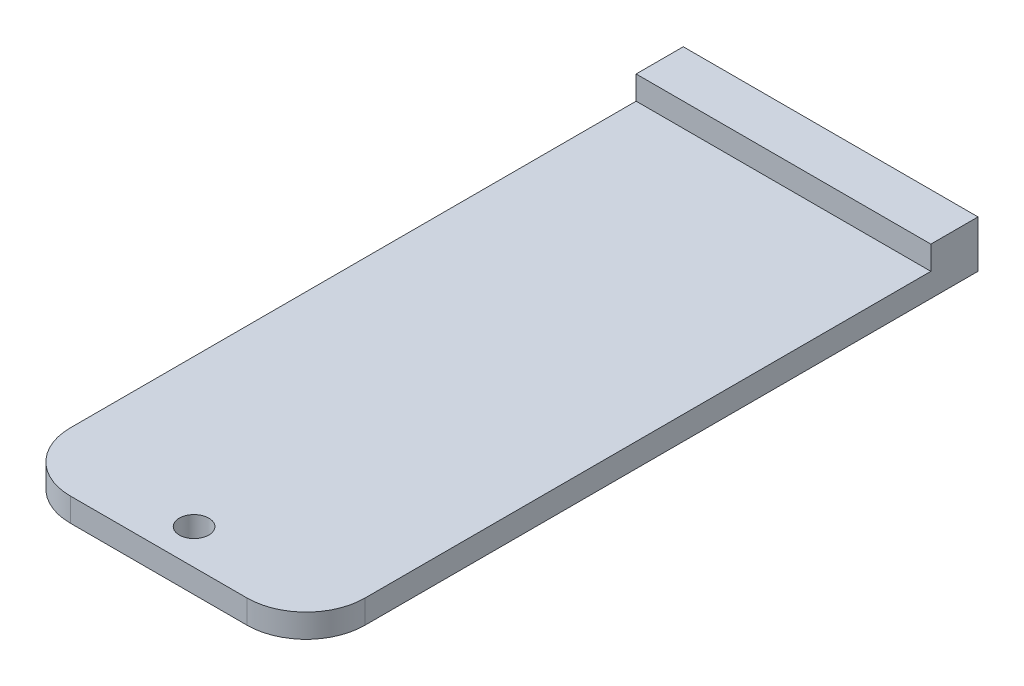
ISO-10303-21;
HEADER;
FILE_DESCRIPTION(('STEP AP214'),'2;1');
FILE_NAME('part.step','',(''),(''),'','','');
FILE_SCHEMA(('AUTOMOTIVE_DESIGN { 1 0 10303 214 1 1 1 1 }'));
ENDSEC;
DATA;
#1=APPLICATION_CONTEXT('core data for automotive mechanical design processes');
#2=APPLICATION_PROTOCOL_DEFINITION('international standard','automotive_design',2000,#1);
#3=PRODUCT_CONTEXT('',#1,'mechanical');
#4=PRODUCT('Part','Part','',(#3));
#5=PRODUCT_RELATED_PRODUCT_CATEGORY('part','',(#4));
#6=PRODUCT_DEFINITION_FORMATION('','',#4);
#7=PRODUCT_DEFINITION_CONTEXT('part definition',#1,'design');
#8=PRODUCT_DEFINITION('design','',#6,#7);
#9=PRODUCT_DEFINITION_SHAPE('','',#8);
#10=(LENGTH_UNIT() NAMED_UNIT(*) SI_UNIT(.MILLI.,.METRE.));
#11=(NAMED_UNIT(*) PLANE_ANGLE_UNIT() SI_UNIT($,.RADIAN.));
#12=(NAMED_UNIT(*) SI_UNIT($,.STERADIAN.) SOLID_ANGLE_UNIT());
#13=UNCERTAINTY_MEASURE_WITH_UNIT(LENGTH_MEASURE(1.E-05),#10,'distance_accuracy_value','');
#14=(GEOMETRIC_REPRESENTATION_CONTEXT(3) GLOBAL_UNCERTAINTY_ASSIGNED_CONTEXT((#13)) GLOBAL_UNIT_ASSIGNED_CONTEXT((#10,
#11,#12)) REPRESENTATION_CONTEXT('',''));
#15=CARTESIAN_POINT('',(0.,0.,0.));
#16=DIRECTION('',(0.,0.,1.));
#17=DIRECTION('',(1.,0.,0.));
#18=AXIS2_PLACEMENT_3D('',#15,#16,#17);
#19=CARTESIAN_POINT('',(-37.5,8.00000000000001,-72.0798724079689));
#20=DIRECTION('',(-1.,0.,0.));
#21=DIRECTION('',(0.,0.,1.));
#22=AXIS2_PLACEMENT_3D('',#19,#20,#21);
#23=PLANE('',#22);
#24=DIRECTION('',(0.,0.,1.));
#25=VECTOR('',#24,1.);
#26=CARTESIAN_POINT('',(-37.5,8.00000000000001,-72.0798724079689));
#27=LINE('',#26,#25);
#28=CARTESIAN_POINT('',(-37.5,8.00000000000001,-51.));
#29=VERTEX_POINT('',#28);
#30=CARTESIAN_POINT('',(-37.5,8.00000000000001,1.));
#31=VERTEX_POINT('',#30);
#32=EDGE_CURVE('E113',#29,#31,#27,.T.);
#33=ORIENTED_EDGE('',*,*,#32,.T.);
#34=DIRECTION('',(0.,-1.,0.));
#35=VECTOR('',#34,1.);
#36=CARTESIAN_POINT('',(-37.5,8.00000000000001,1.));
#37=LINE('',#36,#35);
#38=CARTESIAN_POINT('',(-37.5,10.,1.));
#39=VERTEX_POINT('',#38);
#40=EDGE_CURVE('E60',#31,#39,#37,.F.);
#41=ORIENTED_EDGE('',*,*,#40,.T.);
#42=DIRECTION('',(0.,0.,1.));
#43=VECTOR('',#42,1.);
#44=CARTESIAN_POINT('',(-37.5,10.,-72.0798724079689));
#45=LINE('',#44,#43);
#46=CARTESIAN_POINT('',(-37.5,10.,-47.));
#47=VERTEX_POINT('',#46);
#48=EDGE_CURVE('E163',#47,#39,#45,.T.);
#49=ORIENTED_EDGE('',*,*,#48,.F.);
#50=DIRECTION('',(0.,1.,0.));
#51=VECTOR('',#50,1.);
#52=CARTESIAN_POINT('',(-37.5,12.,-47.));
#53=LINE('',#52,#51);
#54=CARTESIAN_POINT('',(-37.5,12.,-47.));
#55=VERTEX_POINT('',#54);
#56=EDGE_CURVE('E140',#47,#55,#53,.T.);
#57=ORIENTED_EDGE('',*,*,#56,.T.);
#58=DIRECTION('',(0.,0.,1.));
#59=VECTOR('',#58,1.);
#60=CARTESIAN_POINT('',(-37.5,12.,-51.));
#61=LINE('',#60,#59);
#62=CARTESIAN_POINT('',(-37.5,12.,-51.));
#63=VERTEX_POINT('',#62);
#64=EDGE_CURVE('E147',#63,#55,#61,.T.);
#65=ORIENTED_EDGE('',*,*,#64,.F.);
#66=DIRECTION('',(0.,1.,0.));
#67=VECTOR('',#66,1.);
#68=CARTESIAN_POINT('',(-37.5,8.00000000000001,-51.));
#69=LINE('',#68,#67);
#70=EDGE_CURVE('E121',#29,#63,#69,.T.);
#71=ORIENTED_EDGE('',*,*,#70,.F.);
#72=EDGE_LOOP('',(#33,#41,#49,#57,#65,#71));
#73=FACE_BOUND('',#72,.T.);
#74=ADVANCED_FACE('F35',(#73),#23,.T.);
#75=CARTESIAN_POINT('',(-37.5,10.,-72.0798724079689));
#76=DIRECTION('',(0.,1.,0.));
#77=DIRECTION('',(-1.,0.,0.));
#78=AXIS2_PLACEMENT_3D('',#75,#76,#77);
#79=PLANE('',#78);
#80=CARTESIAN_POINT('',(-25.,10.,3.));
#81=DIRECTION('',(0.,1.,0.));
#82=DIRECTION('',(0.,0.,1.));
#83=AXIS2_PLACEMENT_3D('',#80,#81,#82);
#84=CIRCLE('',#83,1.24999999999999);
#85=CARTESIAN_POINT('',(-25.,10.,4.24999999999999));
#86=VERTEX_POINT('',#85);
#87=EDGE_CURVE('E143',#86,#86,#84,.T.);
#88=ORIENTED_EDGE('',*,*,#87,.F.);
#89=EDGE_LOOP('',(#88));
#90=FACE_BOUND('',#89,.T.);
#91=ORIENTED_EDGE('',*,*,#48,.T.);
#92=CARTESIAN_POINT('',(-32.5,10.,1.));
#93=DIRECTION('',(0.,1.,0.));
#94=DIRECTION('',(-1.,0.,0.));
#95=AXIS2_PLACEMENT_3D('',#92,#93,#94);
#96=CIRCLE('',#95,5.);
#97=CARTESIAN_POINT('',(-32.5,10.,6.));
#98=VERTEX_POINT('',#97);
#99=EDGE_CURVE('E44',#39,#98,#96,.T.);
#100=ORIENTED_EDGE('',*,*,#99,.T.);
#101=DIRECTION('',(-1.,0.,0.));
#102=VECTOR('',#101,1.);
#103=CARTESIAN_POINT('',(-37.5,10.,6.));
#104=LINE('',#103,#102);
#105=CARTESIAN_POINT('',(-17.5,10.,6.));
#106=VERTEX_POINT('',#105);
#107=EDGE_CURVE('E153',#106,#98,#104,.T.);
#108=ORIENTED_EDGE('',*,*,#107,.F.);
#109=CARTESIAN_POINT('',(-17.5,10.,1.));
#110=DIRECTION('',(0.,1.,0.));
#111=DIRECTION('',(-1.,0.,0.));
#112=AXIS2_PLACEMENT_3D('',#109,#110,#111);
#113=CIRCLE('',#112,5.);
#114=CARTESIAN_POINT('',(-12.5,10.,1.));
#115=VERTEX_POINT('',#114);
#116=EDGE_CURVE('E52',#106,#115,#113,.T.);
#117=ORIENTED_EDGE('',*,*,#116,.T.);
#118=DIRECTION('',(0.,0.,1.));
#119=VECTOR('',#118,1.);
#120=CARTESIAN_POINT('',(-12.5,10.,-72.0798724079689));
#121=LINE('',#120,#119);
#122=CARTESIAN_POINT('',(-12.5,10.,-47.));
#123=VERTEX_POINT('',#122);
#124=EDGE_CURVE('E112',#123,#115,#121,.T.);
#125=ORIENTED_EDGE('',*,*,#124,.F.);
#126=DIRECTION('',(1.,0.,0.));
#127=VECTOR('',#126,1.);
#128=CARTESIAN_POINT('',(-37.5,10.,-47.));
#129=LINE('',#128,#127);
#130=EDGE_CURVE('E159',#47,#123,#129,.T.);
#131=ORIENTED_EDGE('',*,*,#130,.F.);
#132=EDGE_LOOP('',(#91,#100,#108,#117,#125,#131));
#133=FACE_BOUND('',#132,.T.);
#134=ADVANCED_FACE('F183',(#90,#133),#79,.T.);
#135=CARTESIAN_POINT('',(-12.5,8.00000000000001,-72.0798724079689));
#136=DIRECTION('',(1.,0.,0.));
#137=DIRECTION('',(0.,0.,-1.));
#138=AXIS2_PLACEMENT_3D('',#135,#136,#137);
#139=PLANE('',#138);
#140=ORIENTED_EDGE('',*,*,#124,.T.);
#141=DIRECTION('',(0.,1.,0.));
#142=VECTOR('',#141,1.);
#143=CARTESIAN_POINT('',(-12.5,8.00000000000001,1.));
#144=LINE('',#143,#142);
#145=CARTESIAN_POINT('',(-12.5,8.00000000000001,1.));
#146=VERTEX_POINT('',#145);
#147=EDGE_CURVE('E11',#115,#146,#144,.F.);
#148=ORIENTED_EDGE('',*,*,#147,.T.);
#149=DIRECTION('',(0.,0.,1.));
#150=VECTOR('',#149,1.);
#151=CARTESIAN_POINT('',(-12.5,8.00000000000001,-72.0798724079689));
#152=LINE('',#151,#150);
#153=CARTESIAN_POINT('',(-12.5,8.00000000000001,-51.));
#154=VERTEX_POINT('',#153);
#155=EDGE_CURVE('E102',#154,#146,#152,.T.);
#156=ORIENTED_EDGE('',*,*,#155,.F.);
#157=DIRECTION('',(0.,-1.,0.));
#158=VECTOR('',#157,1.);
#159=CARTESIAN_POINT('',(-12.5,8.00000000000001,-51.));
#160=LINE('',#159,#158);
#161=CARTESIAN_POINT('',(-12.5,12.,-51.));
#162=VERTEX_POINT('',#161);
#163=EDGE_CURVE('E107',#162,#154,#160,.T.);
#164=ORIENTED_EDGE('',*,*,#163,.F.);
#165=DIRECTION('',(0.,0.,1.));
#166=VECTOR('',#165,1.);
#167=CARTESIAN_POINT('',(-12.5,12.,-51.));
#168=LINE('',#167,#166);
#169=CARTESIAN_POINT('',(-12.5,12.,-47.));
#170=VERTEX_POINT('',#169);
#171=EDGE_CURVE('E135',#162,#170,#168,.T.);
#172=ORIENTED_EDGE('',*,*,#171,.T.);
#173=DIRECTION('',(0.,-1.,0.));
#174=VECTOR('',#173,1.);
#175=CARTESIAN_POINT('',(-12.5,10.,-47.));
#176=LINE('',#175,#174);
#177=EDGE_CURVE('E127',#170,#123,#176,.T.);
#178=ORIENTED_EDGE('',*,*,#177,.T.);
#179=EDGE_LOOP('',(#140,#148,#156,#164,#172,#178));
#180=FACE_BOUND('',#179,.T.);
#181=ADVANCED_FACE('F104',(#180),#139,.T.);
#182=CARTESIAN_POINT('',(-37.5,8.00000000000001,-72.0798724079689));
#183=DIRECTION('',(0.,-1.,0.));
#184=DIRECTION('',(0.,0.,-1.));
#185=AXIS2_PLACEMENT_3D('',#182,#183,#184);
#186=PLANE('',#185);
#187=CARTESIAN_POINT('',(-25.,8.00000000000002,3.));
#188=DIRECTION('',(0.,1.,0.));
#189=DIRECTION('',(0.,0.,1.));
#190=AXIS2_PLACEMENT_3D('',#187,#188,#189);
#191=CIRCLE('',#190,1.25);
#192=CARTESIAN_POINT('',(-25.,8.00000000000002,4.25));
#193=VERTEX_POINT('',#192);
#194=EDGE_CURVE('E146',#193,#193,#191,.T.);
#195=ORIENTED_EDGE('',*,*,#194,.T.);
#196=EDGE_LOOP('',(#195));
#197=FACE_BOUND('',#196,.T.);
#198=DIRECTION('',(1.,0.,0.));
#199=VECTOR('',#198,1.);
#200=CARTESIAN_POINT('',(-37.5,8.00000000000001,6.));
#201=LINE('',#200,#199);
#202=CARTESIAN_POINT('',(-32.5,8.00000000000001,6.));
#203=VERTEX_POINT('',#202);
#204=CARTESIAN_POINT('',(-17.5,8.00000000000001,6.));
#205=VERTEX_POINT('',#204);
#206=EDGE_CURVE('E150',#203,#205,#201,.T.);
#207=ORIENTED_EDGE('',*,*,#206,.F.);
#208=CARTESIAN_POINT('',(-32.5,8.00000000000001,1.));
#209=DIRECTION('',(0.,-1.,0.));
#210=DIRECTION('',(0.,0.,-1.));
#211=AXIS2_PLACEMENT_3D('',#208,#209,#210);
#212=CIRCLE('',#211,5.);
#213=EDGE_CURVE('E171',#203,#31,#212,.T.);
#214=ORIENTED_EDGE('',*,*,#213,.T.);
#215=ORIENTED_EDGE('',*,*,#32,.F.);
#216=DIRECTION('',(-1.,0.,0.));
#217=VECTOR('',#216,1.);
#218=CARTESIAN_POINT('',(-12.5,8.00000000000001,-51.));
#219=LINE('',#218,#217);
#220=EDGE_CURVE('E116',#154,#29,#219,.T.);
#221=ORIENTED_EDGE('',*,*,#220,.F.);
#222=ORIENTED_EDGE('',*,*,#155,.T.);
#223=CARTESIAN_POINT('',(-17.5,8.00000000000001,1.));
#224=DIRECTION('',(0.,-1.,0.));
#225=DIRECTION('',(0.,0.,-1.));
#226=AXIS2_PLACEMENT_3D('',#223,#224,#225);
#227=CIRCLE('',#226,5.);
#228=EDGE_CURVE('E173',#146,#205,#227,.T.);
#229=ORIENTED_EDGE('',*,*,#228,.T.);
#230=EDGE_LOOP('',(#207,#214,#215,#221,#222,#229));
#231=FACE_BOUND('',#230,.T.);
#232=ADVANCED_FACE('F118',(#197,#231),#186,.T.);
#233=CARTESIAN_POINT('',(0.,0.,6.));
#234=DIRECTION('',(0.,0.,1.));
#235=DIRECTION('',(1.,0.,0.));
#236=AXIS2_PLACEMENT_3D('',#233,#234,#235);
#237=PLANE('',#236);
#238=ORIENTED_EDGE('',*,*,#107,.T.);
#239=DIRECTION('',(0.,-1.,0.));
#240=VECTOR('',#239,1.);
#241=CARTESIAN_POINT('',(-32.5,0.,6.));
#242=LINE('',#241,#240);
#243=EDGE_CURVE('E175',#98,#203,#242,.T.);
#244=ORIENTED_EDGE('',*,*,#243,.T.);
#245=ORIENTED_EDGE('',*,*,#206,.T.);
#246=DIRECTION('',(0.,1.,0.));
#247=VECTOR('',#246,1.);
#248=CARTESIAN_POINT('',(-17.5,0.,6.));
#249=LINE('',#248,#247);
#250=EDGE_CURVE('E162',#205,#106,#249,.T.);
#251=ORIENTED_EDGE('',*,*,#250,.T.);
#252=EDGE_LOOP('',(#238,#244,#245,#251));
#253=FACE_BOUND('',#252,.T.);
#254=ADVANCED_FACE('F185',(#253),#237,.T.);
#255=CARTESIAN_POINT('',(-25.,10.,3.));
#256=DIRECTION('',(0.,1.,0.));
#257=DIRECTION('',(0.,0.,1.));
#258=AXIS2_PLACEMENT_3D('',#255,#256,#257);
#259=CYLINDRICAL_SURFACE('',#258,1.24999999999999);
#260=ORIENTED_EDGE('',*,*,#194,.F.);
#261=EDGE_LOOP('',(#260));
#262=FACE_BOUND('',#261,.T.);
#263=ORIENTED_EDGE('',*,*,#87,.T.);
#264=EDGE_LOOP('',(#263));
#265=FACE_BOUND('',#264,.T.);
#266=ADVANCED_FACE('F196',(#262,#265),#259,.F.);
#267=CARTESIAN_POINT('',(-32.5,0.,1.));
#268=DIRECTION('',(0.,-1.,0.));
#269=DIRECTION('',(0.,0.,-1.));
#270=AXIS2_PLACEMENT_3D('',#267,#268,#269);
#271=CYLINDRICAL_SURFACE('',#270,5.);
#272=ORIENTED_EDGE('',*,*,#99,.F.);
#273=ORIENTED_EDGE('',*,*,#40,.F.);
#274=ORIENTED_EDGE('',*,*,#213,.F.);
#275=ORIENTED_EDGE('',*,*,#243,.F.);
#276=EDGE_LOOP('',(#272,#273,#274,#275));
#277=FACE_BOUND('',#276,.T.);
#278=ADVANCED_FACE('F181',(#277),#271,.T.);
#279=CARTESIAN_POINT('',(-17.5,0.,1.));
#280=DIRECTION('',(0.,1.,0.));
#281=DIRECTION('',(0.,0.,1.));
#282=AXIS2_PLACEMENT_3D('',#279,#280,#281);
#283=CYLINDRICAL_SURFACE('',#282,5.);
#284=ORIENTED_EDGE('',*,*,#228,.F.);
#285=ORIENTED_EDGE('',*,*,#147,.F.);
#286=ORIENTED_EDGE('',*,*,#116,.F.);
#287=ORIENTED_EDGE('',*,*,#250,.F.);
#288=EDGE_LOOP('',(#284,#285,#286,#287));
#289=FACE_BOUND('',#288,.T.);
#290=ADVANCED_FACE('F37',(#289),#283,.T.);
#291=CARTESIAN_POINT('',(-12.5,12.,-51.));
#292=DIRECTION('',(0.,-1.,0.));
#293=DIRECTION('',(0.,0.,-1.));
#294=AXIS2_PLACEMENT_3D('',#291,#292,#293);
#295=PLANE('',#294);
#296=DIRECTION('',(1.,0.,0.));
#297=VECTOR('',#296,1.);
#298=CARTESIAN_POINT('',(-12.5,12.,-47.));
#299=LINE('',#298,#297);
#300=EDGE_CURVE('E130',#55,#170,#299,.T.);
#301=ORIENTED_EDGE('',*,*,#300,.T.);
#302=ORIENTED_EDGE('',*,*,#171,.F.);
#303=DIRECTION('',(1.,0.,0.));
#304=VECTOR('',#303,1.);
#305=CARTESIAN_POINT('',(-12.5,12.,-51.));
#306=LINE('',#305,#304);
#307=EDGE_CURVE('E125',#63,#162,#306,.T.);
#308=ORIENTED_EDGE('',*,*,#307,.F.);
#309=ORIENTED_EDGE('',*,*,#64,.T.);
#310=EDGE_LOOP('',(#301,#302,#308,#309));
#311=FACE_BOUND('',#310,.T.);
#312=ADVANCED_FACE('F189',(#311),#295,.F.);
#313=CARTESIAN_POINT('',(0.,0.,-51.));
#314=DIRECTION('',(0.,0.,1.));
#315=DIRECTION('',(1.,0.,0.));
#316=AXIS2_PLACEMENT_3D('',#313,#314,#315);
#317=PLANE('',#316);
#318=ORIENTED_EDGE('',*,*,#163,.T.);
#319=ORIENTED_EDGE('',*,*,#220,.T.);
#320=ORIENTED_EDGE('',*,*,#70,.T.);
#321=ORIENTED_EDGE('',*,*,#307,.T.);
#322=EDGE_LOOP('',(#318,#319,#320,#321));
#323=FACE_BOUND('',#322,.T.);
#324=ADVANCED_FACE('F123',(#323),#317,.F.);
#325=CARTESIAN_POINT('',(0.,0.,-47.));
#326=DIRECTION('',(0.,0.,1.));
#327=DIRECTION('',(1.,0.,0.));
#328=AXIS2_PLACEMENT_3D('',#325,#326,#327);
#329=PLANE('',#328);
#330=ORIENTED_EDGE('',*,*,#56,.F.);
#331=ORIENTED_EDGE('',*,*,#130,.T.);
#332=ORIENTED_EDGE('',*,*,#177,.F.);
#333=ORIENTED_EDGE('',*,*,#300,.F.);
#334=EDGE_LOOP('',(#330,#331,#332,#333));
#335=FACE_BOUND('',#334,.T.);
#336=ADVANCED_FACE('F215',(#335),#329,.T.);
#337=CLOSED_SHELL('',(#74,#134,#181,#232,#254,#266,#278,#290,#312,#324,#336));
#338=MANIFOLD_SOLID_BREP('B2',#337);
#339=ADVANCED_BREP_SHAPE_REPRESENTATION('',(#18,#338),#14);
#340=SHAPE_DEFINITION_REPRESENTATION(#9,#339);
ENDSEC;
END-ISO-10303-21;
